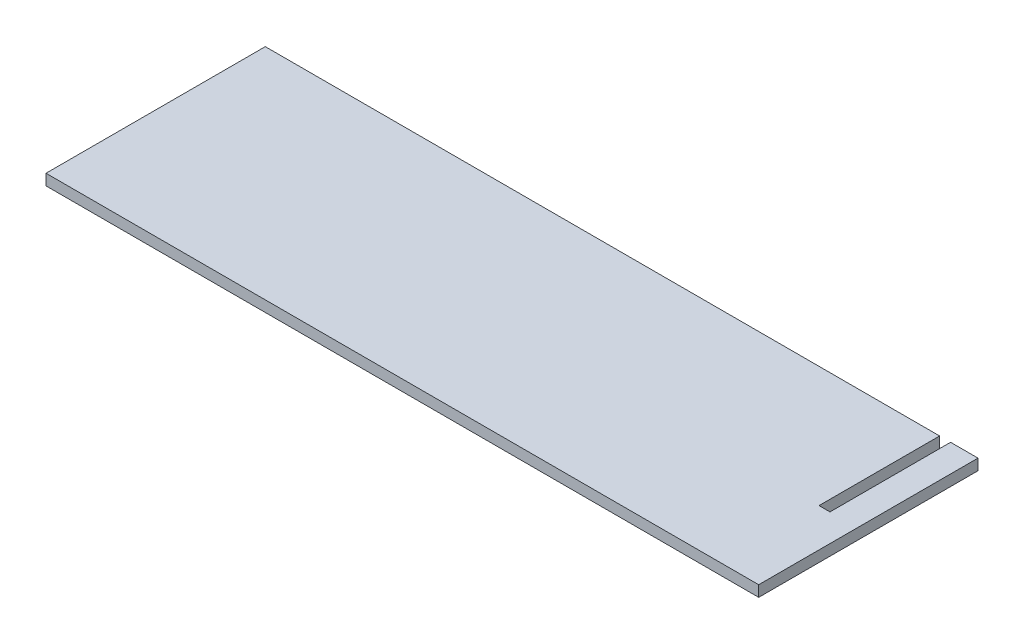
ISO-10303-21;
HEADER;
FILE_DESCRIPTION(('STEP AP214'),'2;1');
FILE_NAME('part.step','',(''),(''),'','','');
FILE_SCHEMA(('AUTOMOTIVE_DESIGN { 1 0 10303 214 1 1 1 1 }'));
ENDSEC;
DATA;
#1=APPLICATION_CONTEXT('core data for automotive mechanical design processes');
#2=APPLICATION_PROTOCOL_DEFINITION('international standard','automotive_design',2000,#1);
#3=PRODUCT_CONTEXT('',#1,'mechanical');
#4=PRODUCT('Part','Part','',(#3));
#5=PRODUCT_RELATED_PRODUCT_CATEGORY('part','',(#4));
#6=PRODUCT_DEFINITION_FORMATION('','',#4);
#7=PRODUCT_DEFINITION_CONTEXT('part definition',#1,'design');
#8=PRODUCT_DEFINITION('design','',#6,#7);
#9=PRODUCT_DEFINITION_SHAPE('','',#8);
#10=(LENGTH_UNIT() NAMED_UNIT(*) SI_UNIT(.MILLI.,.METRE.));
#11=(NAMED_UNIT(*) PLANE_ANGLE_UNIT() SI_UNIT($,.RADIAN.));
#12=(NAMED_UNIT(*) SI_UNIT($,.STERADIAN.) SOLID_ANGLE_UNIT());
#13=UNCERTAINTY_MEASURE_WITH_UNIT(LENGTH_MEASURE(1.E-05),#10,'distance_accuracy_value','');
#14=(GEOMETRIC_REPRESENTATION_CONTEXT(3) GLOBAL_UNCERTAINTY_ASSIGNED_CONTEXT((#13)) GLOBAL_UNIT_ASSIGNED_CONTEXT((#10,
#11,#12)) REPRESENTATION_CONTEXT('',''));
#15=CARTESIAN_POINT('',(0.,0.,0.));
#16=DIRECTION('',(0.,0.,1.));
#17=DIRECTION('',(1.,0.,0.));
#18=AXIS2_PLACEMENT_3D('',#15,#16,#17);
#19=CARTESIAN_POINT('',(65.,1.,-20.0000000000001));
#20=DIRECTION('',(-1.,0.,0.));
#21=DIRECTION('',(0.,0.,1.));
#22=AXIS2_PLACEMENT_3D('',#19,#20,#21);
#23=PLANE('',#22);
#24=DIRECTION('',(0.,0.,-1.));
#25=VECTOR('',#24,1.);
#26=CARTESIAN_POINT('',(65.,-1.,-20.0000000000001));
#27=LINE('',#26,#25);
#28=CARTESIAN_POINT('',(65.,-1.,20.));
#29=VERTEX_POINT('',#28);
#30=CARTESIAN_POINT('',(65.,-1.,-20.0000000000001));
#31=VERTEX_POINT('',#30);
#32=EDGE_CURVE('E146',#29,#31,#27,.T.);
#33=ORIENTED_EDGE('',*,*,#32,.T.);
#34=DIRECTION('',(0.,-1.,0.));
#35=VECTOR('',#34,1.);
#36=CARTESIAN_POINT('',(65.,1.,-20.0000000000001));
#37=LINE('',#36,#35);
#38=CARTESIAN_POINT('',(65.,1.,-20.0000000000001));
#39=VERTEX_POINT('',#38);
#40=EDGE_CURVE('E11',#39,#31,#37,.T.);
#41=ORIENTED_EDGE('',*,*,#40,.F.);
#42=DIRECTION('',(0.,0.,-1.));
#43=VECTOR('',#42,1.);
#44=CARTESIAN_POINT('',(65.,1.,-20.0000000000001));
#45=LINE('',#44,#43);
#46=CARTESIAN_POINT('',(65.,1.,20.));
#47=VERTEX_POINT('',#46);
#48=EDGE_CURVE('E168',#47,#39,#45,.T.);
#49=ORIENTED_EDGE('',*,*,#48,.F.);
#50=DIRECTION('',(0.,-1.,0.));
#51=VECTOR('',#50,1.);
#52=CARTESIAN_POINT('',(65.,1.,20.));
#53=LINE('',#52,#51);
#54=EDGE_CURVE('E142',#47,#29,#53,.T.);
#55=ORIENTED_EDGE('',*,*,#54,.T.);
#56=EDGE_LOOP('',(#33,#41,#49,#55));
#57=FACE_BOUND('',#56,.T.);
#58=ADVANCED_FACE('F45',(#57),#23,.F.);
#59=CARTESIAN_POINT('',(60.,1.,-20.));
#60=DIRECTION('',(0.,0.,1.));
#61=DIRECTION('',(1.,0.,0.));
#62=AXIS2_PLACEMENT_3D('',#59,#60,#61);
#63=PLANE('',#62);
#64=DIRECTION('',(-1.,0.,0.));
#65=VECTOR('',#64,1.);
#66=CARTESIAN_POINT('',(60.,-1.,-20.));
#67=LINE('',#66,#65);
#68=CARTESIAN_POINT('',(60.,-1.,-20.));
#69=VERTEX_POINT('',#68);
#70=EDGE_CURVE('E150',#31,#69,#67,.T.);
#71=ORIENTED_EDGE('',*,*,#70,.T.);
#72=DIRECTION('',(0.,-1.,0.));
#73=VECTOR('',#72,1.);
#74=CARTESIAN_POINT('',(60.,1.,-20.));
#75=LINE('',#74,#73);
#76=CARTESIAN_POINT('',(60.,1.,-20.));
#77=VERTEX_POINT('',#76);
#78=EDGE_CURVE('E54',#77,#69,#75,.T.);
#79=ORIENTED_EDGE('',*,*,#78,.F.);
#80=DIRECTION('',(-1.,0.,0.));
#81=VECTOR('',#80,1.);
#82=CARTESIAN_POINT('',(60.,1.,-20.));
#83=LINE('',#82,#81);
#84=EDGE_CURVE('E105',#39,#77,#83,.T.);
#85=ORIENTED_EDGE('',*,*,#84,.F.);
#86=ORIENTED_EDGE('',*,*,#40,.T.);
#87=EDGE_LOOP('',(#71,#79,#85,#86));
#88=FACE_BOUND('',#87,.T.);
#89=ADVANCED_FACE('F214',(#88),#63,.F.);
#90=CARTESIAN_POINT('',(60.,1.,-20.));
#91=DIRECTION('',(1.,0.,0.));
#92=DIRECTION('',(0.,0.,-1.));
#93=AXIS2_PLACEMENT_3D('',#90,#91,#92);
#94=PLANE('',#93);
#95=DIRECTION('',(0.,0.,1.));
#96=VECTOR('',#95,1.);
#97=CARTESIAN_POINT('',(60.,-1.,-20.));
#98=LINE('',#97,#96);
#99=CARTESIAN_POINT('',(60.,-1.,2.));
#100=VERTEX_POINT('',#99);
#101=EDGE_CURVE('E153',#69,#100,#98,.T.);
#102=ORIENTED_EDGE('',*,*,#101,.T.);
#103=DIRECTION('',(0.,-1.,0.));
#104=VECTOR('',#103,1.);
#105=CARTESIAN_POINT('',(60.,1.,2.));
#106=LINE('',#105,#104);
#107=CARTESIAN_POINT('',(60.,1.,2.));
#108=VERTEX_POINT('',#107);
#109=EDGE_CURVE('E179',#108,#100,#106,.T.);
#110=ORIENTED_EDGE('',*,*,#109,.F.);
#111=DIRECTION('',(0.,0.,1.));
#112=VECTOR('',#111,1.);
#113=CARTESIAN_POINT('',(60.,1.,-20.));
#114=LINE('',#113,#112);
#115=EDGE_CURVE('E189',#77,#108,#114,.T.);
#116=ORIENTED_EDGE('',*,*,#115,.F.);
#117=ORIENTED_EDGE('',*,*,#78,.T.);
#118=EDGE_LOOP('',(#102,#110,#116,#117));
#119=FACE_BOUND('',#118,.T.);
#120=ADVANCED_FACE('F187',(#119),#94,.F.);
#121=CARTESIAN_POINT('',(58.,1.,2.));
#122=DIRECTION('',(0.,0.,1.));
#123=DIRECTION('',(1.,0.,0.));
#124=AXIS2_PLACEMENT_3D('',#121,#122,#123);
#125=PLANE('',#124);
#126=DIRECTION('',(-1.,0.,0.));
#127=VECTOR('',#126,1.);
#128=CARTESIAN_POINT('',(58.,-1.,2.));
#129=LINE('',#128,#127);
#130=CARTESIAN_POINT('',(58.,-1.,2.));
#131=VERTEX_POINT('',#130);
#132=EDGE_CURVE('E156',#100,#131,#129,.T.);
#133=ORIENTED_EDGE('',*,*,#132,.T.);
#134=DIRECTION('',(0.,-1.,0.));
#135=VECTOR('',#134,1.);
#136=CARTESIAN_POINT('',(58.,1.,2.));
#137=LINE('',#136,#135);
#138=CARTESIAN_POINT('',(58.,1.,2.));
#139=VERTEX_POINT('',#138);
#140=EDGE_CURVE('E175',#139,#131,#137,.T.);
#141=ORIENTED_EDGE('',*,*,#140,.F.);
#142=DIRECTION('',(-1.,0.,0.));
#143=VECTOR('',#142,1.);
#144=CARTESIAN_POINT('',(58.,1.,2.));
#145=LINE('',#144,#143);
#146=EDGE_CURVE('E202',#108,#139,#145,.T.);
#147=ORIENTED_EDGE('',*,*,#146,.F.);
#148=ORIENTED_EDGE('',*,*,#109,.T.);
#149=EDGE_LOOP('',(#133,#141,#147,#148));
#150=FACE_BOUND('',#149,.T.);
#151=ADVANCED_FACE('F197',(#150),#125,.F.);
#152=CARTESIAN_POINT('',(58.,1.,-20.));
#153=DIRECTION('',(-1.,0.,0.));
#154=DIRECTION('',(0.,0.,1.));
#155=AXIS2_PLACEMENT_3D('',#152,#153,#154);
#156=PLANE('',#155);
#157=DIRECTION('',(0.,0.,-1.));
#158=VECTOR('',#157,1.);
#159=CARTESIAN_POINT('',(58.,-1.,-20.));
#160=LINE('',#159,#158);
#161=CARTESIAN_POINT('',(58.,-1.,-20.));
#162=VERTEX_POINT('',#161);
#163=EDGE_CURVE('E159',#131,#162,#160,.T.);
#164=ORIENTED_EDGE('',*,*,#163,.T.);
#165=DIRECTION('',(0.,-1.,0.));
#166=VECTOR('',#165,1.);
#167=CARTESIAN_POINT('',(58.,1.,-20.));
#168=LINE('',#167,#166);
#169=CARTESIAN_POINT('',(58.,1.,-20.));
#170=VERTEX_POINT('',#169);
#171=EDGE_CURVE('E135',#170,#162,#168,.T.);
#172=ORIENTED_EDGE('',*,*,#171,.F.);
#173=DIRECTION('',(0.,0.,-1.));
#174=VECTOR('',#173,1.);
#175=CARTESIAN_POINT('',(58.,1.,-20.));
#176=LINE('',#175,#174);
#177=EDGE_CURVE('E124',#139,#170,#176,.T.);
#178=ORIENTED_EDGE('',*,*,#177,.F.);
#179=ORIENTED_EDGE('',*,*,#140,.T.);
#180=EDGE_LOOP('',(#164,#172,#178,#179));
#181=FACE_BOUND('',#180,.T.);
#182=ADVANCED_FACE('F200',(#181),#156,.F.);
#183=CARTESIAN_POINT('',(-65.,1.,-20.0000000000001));
#184=DIRECTION('',(0.,0.,1.));
#185=DIRECTION('',(1.,0.,0.));
#186=AXIS2_PLACEMENT_3D('',#183,#184,#185);
#187=PLANE('',#186);
#188=DIRECTION('',(-1.,0.,0.));
#189=VECTOR('',#188,1.);
#190=CARTESIAN_POINT('',(-65.,-1.,-20.0000000000001));
#191=LINE('',#190,#189);
#192=CARTESIAN_POINT('',(-65.,-1.,-20.0000000000001));
#193=VERTEX_POINT('',#192);
#194=EDGE_CURVE('E133',#162,#193,#191,.T.);
#195=ORIENTED_EDGE('',*,*,#194,.T.);
#196=DIRECTION('',(0.,-1.,0.));
#197=VECTOR('',#196,1.);
#198=CARTESIAN_POINT('',(-65.,1.,-20.0000000000001));
#199=LINE('',#198,#197);
#200=CARTESIAN_POINT('',(-65.,1.,-20.0000000000001));
#201=VERTEX_POINT('',#200);
#202=EDGE_CURVE('E130',#201,#193,#199,.T.);
#203=ORIENTED_EDGE('',*,*,#202,.F.);
#204=DIRECTION('',(-1.,0.,0.));
#205=VECTOR('',#204,1.);
#206=CARTESIAN_POINT('',(-65.,1.,-20.0000000000001));
#207=LINE('',#206,#205);
#208=EDGE_CURVE('E118',#170,#201,#207,.T.);
#209=ORIENTED_EDGE('',*,*,#208,.F.);
#210=ORIENTED_EDGE('',*,*,#171,.T.);
#211=EDGE_LOOP('',(#195,#203,#209,#210));
#212=FACE_BOUND('',#211,.T.);
#213=ADVANCED_FACE('F131',(#212),#187,.F.);
#214=CARTESIAN_POINT('',(-65.,1.,-20.0000000000001));
#215=DIRECTION('',(1.,0.,0.));
#216=DIRECTION('',(0.,0.,-1.));
#217=AXIS2_PLACEMENT_3D('',#214,#215,#216);
#218=PLANE('',#217);
#219=DIRECTION('',(0.,0.,1.));
#220=VECTOR('',#219,1.);
#221=CARTESIAN_POINT('',(-65.,-1.,-20.0000000000001));
#222=LINE('',#221,#220);
#223=CARTESIAN_POINT('',(-65.,-1.,20.));
#224=VERTEX_POINT('',#223);
#225=EDGE_CURVE('E91',#193,#224,#222,.T.);
#226=ORIENTED_EDGE('',*,*,#225,.T.);
#227=DIRECTION('',(0.,-1.,0.));
#228=VECTOR('',#227,1.);
#229=CARTESIAN_POINT('',(-65.,1.,20.));
#230=LINE('',#229,#228);
#231=CARTESIAN_POINT('',(-65.,1.,20.));
#232=VERTEX_POINT('',#231);
#233=EDGE_CURVE('E136',#232,#224,#230,.T.);
#234=ORIENTED_EDGE('',*,*,#233,.F.);
#235=DIRECTION('',(0.,0.,1.));
#236=VECTOR('',#235,1.);
#237=CARTESIAN_POINT('',(-65.,1.,-20.0000000000001));
#238=LINE('',#237,#236);
#239=EDGE_CURVE('E122',#201,#232,#238,.T.);
#240=ORIENTED_EDGE('',*,*,#239,.F.);
#241=ORIENTED_EDGE('',*,*,#202,.T.);
#242=EDGE_LOOP('',(#226,#234,#240,#241));
#243=FACE_BOUND('',#242,.T.);
#244=ADVANCED_FACE('F138',(#243),#218,.F.);
#245=CARTESIAN_POINT('',(-65.,1.,20.));
#246=DIRECTION('',(0.,0.,-1.));
#247=DIRECTION('',(-1.,0.,0.));
#248=AXIS2_PLACEMENT_3D('',#245,#246,#247);
#249=PLANE('',#248);
#250=DIRECTION('',(1.,0.,0.));
#251=VECTOR('',#250,1.);
#252=CARTESIAN_POINT('',(-65.,-1.,20.));
#253=LINE('',#252,#251);
#254=EDGE_CURVE('E97',#224,#29,#253,.T.);
#255=ORIENTED_EDGE('',*,*,#254,.T.);
#256=ORIENTED_EDGE('',*,*,#54,.F.);
#257=DIRECTION('',(1.,0.,0.));
#258=VECTOR('',#257,1.);
#259=CARTESIAN_POINT('',(-65.,1.,20.));
#260=LINE('',#259,#258);
#261=EDGE_CURVE('E62',#232,#47,#260,.T.);
#262=ORIENTED_EDGE('',*,*,#261,.F.);
#263=ORIENTED_EDGE('',*,*,#233,.T.);
#264=EDGE_LOOP('',(#255,#256,#262,#263));
#265=FACE_BOUND('',#264,.T.);
#266=ADVANCED_FACE('F230',(#265),#249,.F.);
#267=CARTESIAN_POINT('',(0.,1.,0.));
#268=DIRECTION('',(0.,1.,0.));
#269=DIRECTION('',(0.,0.,1.));
#270=AXIS2_PLACEMENT_3D('',#267,#268,#269);
#271=PLANE('',#270);
#272=ORIENTED_EDGE('',*,*,#48,.T.);
#273=ORIENTED_EDGE('',*,*,#84,.T.);
#274=ORIENTED_EDGE('',*,*,#115,.T.);
#275=ORIENTED_EDGE('',*,*,#146,.T.);
#276=ORIENTED_EDGE('',*,*,#177,.T.);
#277=ORIENTED_EDGE('',*,*,#208,.T.);
#278=ORIENTED_EDGE('',*,*,#239,.T.);
#279=ORIENTED_EDGE('',*,*,#261,.T.);
#280=EDGE_LOOP('',(#272,#273,#274,#275,#276,#277,#278,#279));
#281=FACE_BOUND('',#280,.T.);
#282=ADVANCED_FACE('F120',(#281),#271,.T.);
#283=CARTESIAN_POINT('',(0.,-1.,0.));
#284=DIRECTION('',(0.,1.,0.));
#285=DIRECTION('',(0.,0.,1.));
#286=AXIS2_PLACEMENT_3D('',#283,#284,#285);
#287=PLANE('',#286);
#288=ORIENTED_EDGE('',*,*,#32,.F.);
#289=ORIENTED_EDGE('',*,*,#254,.F.);
#290=ORIENTED_EDGE('',*,*,#225,.F.);
#291=ORIENTED_EDGE('',*,*,#194,.F.);
#292=ORIENTED_EDGE('',*,*,#163,.F.);
#293=ORIENTED_EDGE('',*,*,#132,.F.);
#294=ORIENTED_EDGE('',*,*,#101,.F.);
#295=ORIENTED_EDGE('',*,*,#70,.F.);
#296=EDGE_LOOP('',(#288,#289,#290,#291,#292,#293,#294,#295));
#297=FACE_BOUND('',#296,.T.);
#298=ADVANCED_FACE('F193',(#297),#287,.F.);
#299=CLOSED_SHELL('',(#58,#89,#120,#151,#182,#213,#244,#266,#282,#298));
#300=MANIFOLD_SOLID_BREP('B2',#299);
#301=ADVANCED_BREP_SHAPE_REPRESENTATION('',(#18,#300),#14);
#302=SHAPE_DEFINITION_REPRESENTATION(#9,#301);
ENDSEC;
END-ISO-10303-21;
